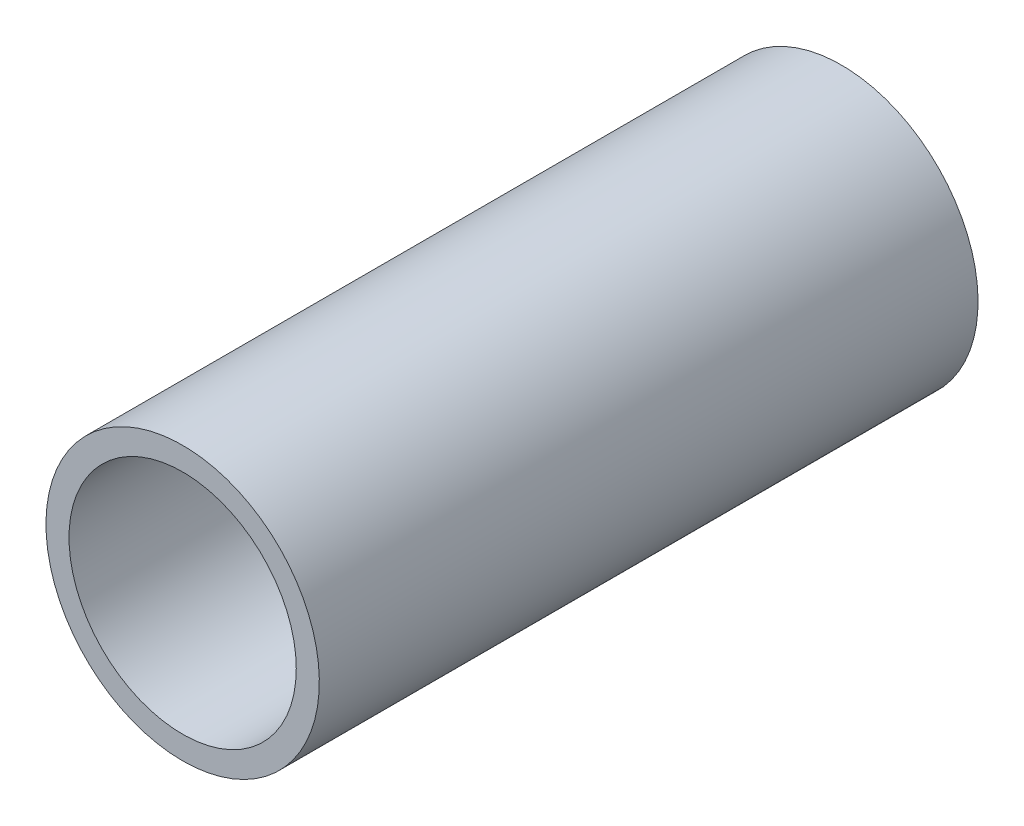
ISO-10303-21;
HEADER;
FILE_DESCRIPTION(('STEP AP214'),'2;1');
FILE_NAME('part.step','',(''),(''),'','','');
FILE_SCHEMA(('AUTOMOTIVE_DESIGN { 1 0 10303 214 1 1 1 1 }'));
ENDSEC;
DATA;
#1=APPLICATION_CONTEXT('core data for automotive mechanical design processes');
#2=APPLICATION_PROTOCOL_DEFINITION('international standard','automotive_design',2000,#1);
#3=PRODUCT_CONTEXT('',#1,'mechanical');
#4=PRODUCT('Part','Part','',(#3));
#5=PRODUCT_RELATED_PRODUCT_CATEGORY('part','',(#4));
#6=PRODUCT_DEFINITION_FORMATION('','',#4);
#7=PRODUCT_DEFINITION_CONTEXT('part definition',#1,'design');
#8=PRODUCT_DEFINITION('design','',#6,#7);
#9=PRODUCT_DEFINITION_SHAPE('','',#8);
#10=(LENGTH_UNIT() NAMED_UNIT(*) SI_UNIT(.MILLI.,.METRE.));
#11=(NAMED_UNIT(*) PLANE_ANGLE_UNIT() SI_UNIT($,.RADIAN.));
#12=(NAMED_UNIT(*) SI_UNIT($,.STERADIAN.) SOLID_ANGLE_UNIT());
#13=UNCERTAINTY_MEASURE_WITH_UNIT(LENGTH_MEASURE(1.E-05),#10,'distance_accuracy_value','');
#14=(GEOMETRIC_REPRESENTATION_CONTEXT(3) GLOBAL_UNCERTAINTY_ASSIGNED_CONTEXT((#13)) GLOBAL_UNIT_ASSIGNED_CONTEXT((#10,
#11,#12)) REPRESENTATION_CONTEXT('',''));
#15=CARTESIAN_POINT('',(0.,0.,0.));
#16=DIRECTION('',(0.,0.,1.));
#17=DIRECTION('',(1.,0.,0.));
#18=AXIS2_PLACEMENT_3D('',#15,#16,#17);
#19=CARTESIAN_POINT('',(0.,0.,0.));
#20=DIRECTION('',(0.,0.,1.));
#21=DIRECTION('',(1.,0.,0.));
#22=AXIS2_PLACEMENT_3D('',#19,#20,#21);
#23=CYLINDRICAL_SURFACE('',#22,17.526);
#24=CARTESIAN_POINT('',(0.,0.,101.6));
#25=DIRECTION('',(0.,0.,1.));
#26=DIRECTION('',(1.,0.,0.));
#27=AXIS2_PLACEMENT_3D('',#24,#25,#26);
#28=CIRCLE('',#27,17.526);
#29=CARTESIAN_POINT('',(17.526,0.,101.6));
#30=VERTEX_POINT('',#29);
#31=EDGE_CURVE('E9',#30,#30,#28,.T.);
#32=ORIENTED_EDGE('',*,*,#31,.T.);
#33=EDGE_LOOP('',(#32));
#34=FACE_BOUND('',#33,.T.);
#35=CARTESIAN_POINT('',(0.,0.,0.));
#36=DIRECTION('',(0.,0.,1.));
#37=DIRECTION('',(1.,0.,0.));
#38=AXIS2_PLACEMENT_3D('',#35,#36,#37);
#39=CIRCLE('',#38,17.526);
#40=CARTESIAN_POINT('',(17.526,0.,0.));
#41=VERTEX_POINT('',#40);
#42=EDGE_CURVE('E27',#41,#41,#39,.T.);
#43=ORIENTED_EDGE('',*,*,#42,.F.);
#44=EDGE_LOOP('',(#43));
#45=FACE_BOUND('',#44,.T.);
#46=ADVANCED_FACE('F14',(#34,#45),#23,.F.);
#47=CARTESIAN_POINT('',(0.,0.,0.));
#48=DIRECTION('',(0.,0.,1.));
#49=DIRECTION('',(1.,0.,0.));
#50=AXIS2_PLACEMENT_3D('',#47,#48,#49);
#51=CYLINDRICAL_SURFACE('',#50,21.082);
#52=CARTESIAN_POINT('',(0.,0.,101.6));
#53=DIRECTION('',(0.,0.,-1.));
#54=DIRECTION('',(0.,-1.,0.));
#55=AXIS2_PLACEMENT_3D('',#52,#53,#54);
#56=CIRCLE('',#55,21.082);
#57=CARTESIAN_POINT('',(0.,-21.082,101.6));
#58=VERTEX_POINT('',#57);
#59=EDGE_CURVE('E21',#58,#58,#56,.T.);
#60=ORIENTED_EDGE('',*,*,#59,.T.);
#61=EDGE_LOOP('',(#60));
#62=FACE_BOUND('',#61,.T.);
#63=CARTESIAN_POINT('',(0.,0.,0.));
#64=DIRECTION('',(0.,0.,-1.));
#65=DIRECTION('',(0.,-1.,0.));
#66=AXIS2_PLACEMENT_3D('',#63,#64,#65);
#67=CIRCLE('',#66,21.082);
#68=CARTESIAN_POINT('',(0.,-21.082,0.));
#69=VERTEX_POINT('',#68);
#70=EDGE_CURVE('E17',#69,#69,#67,.T.);
#71=ORIENTED_EDGE('',*,*,#70,.F.);
#72=EDGE_LOOP('',(#71));
#73=FACE_BOUND('',#72,.T.);
#74=ADVANCED_FACE('F36',(#62,#73),#51,.T.);
#75=CARTESIAN_POINT('',(0.,0.,0.));
#76=DIRECTION('',(0.,0.,1.));
#77=DIRECTION('',(1.,0.,0.));
#78=AXIS2_PLACEMENT_3D('',#75,#76,#77);
#79=PLANE('',#78);
#80=ORIENTED_EDGE('',*,*,#70,.T.);
#81=EDGE_LOOP('',(#80));
#82=FACE_BOUND('',#81,.T.);
#83=ORIENTED_EDGE('',*,*,#42,.T.);
#84=EDGE_LOOP('',(#83));
#85=FACE_BOUND('',#84,.T.);
#86=ADVANCED_FACE('F34',(#82,#85),#79,.F.);
#87=CARTESIAN_POINT('',(0.,0.,101.6));
#88=DIRECTION('',(0.,0.,1.));
#89=DIRECTION('',(1.,0.,0.));
#90=AXIS2_PLACEMENT_3D('',#87,#88,#89);
#91=PLANE('',#90);
#92=ORIENTED_EDGE('',*,*,#59,.F.);
#93=EDGE_LOOP('',(#92));
#94=FACE_BOUND('',#93,.T.);
#95=ORIENTED_EDGE('',*,*,#31,.F.);
#96=EDGE_LOOP('',(#95));
#97=FACE_BOUND('',#96,.T.);
#98=ADVANCED_FACE('F44',(#94,#97),#91,.T.);
#99=CLOSED_SHELL('',(#46,#74,#86,#98));
#100=MANIFOLD_SOLID_BREP('B1',#99);
#101=ADVANCED_BREP_SHAPE_REPRESENTATION('',(#18,#100),#14);
#102=SHAPE_DEFINITION_REPRESENTATION(#9,#101);
ENDSEC;
END-ISO-10303-21;
